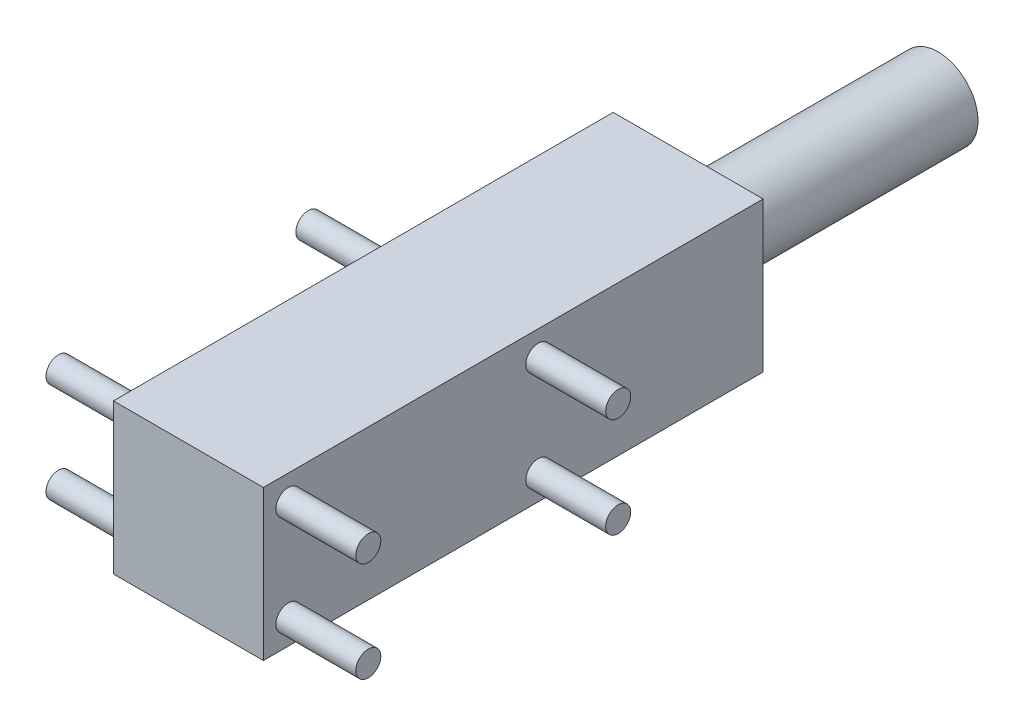
ISO-10303-21;
HEADER;
FILE_DESCRIPTION(('STEP AP214'),'2;1');
FILE_NAME('part.step','',(''),(''),'','','');
FILE_SCHEMA(('AUTOMOTIVE_DESIGN { 1 0 10303 214 1 1 1 1 }'));
ENDSEC;
DATA;
#1=APPLICATION_CONTEXT('core data for automotive mechanical design processes');
#2=APPLICATION_PROTOCOL_DEFINITION('international standard','automotive_design',2000,#1);
#3=PRODUCT_CONTEXT('',#1,'mechanical');
#4=PRODUCT('Part','Part','',(#3));
#5=PRODUCT_RELATED_PRODUCT_CATEGORY('part','',(#4));
#6=PRODUCT_DEFINITION_FORMATION('','',#4);
#7=PRODUCT_DEFINITION_CONTEXT('part definition',#1,'design');
#8=PRODUCT_DEFINITION('design','',#6,#7);
#9=PRODUCT_DEFINITION_SHAPE('','',#8);
#10=(LENGTH_UNIT() NAMED_UNIT(*) SI_UNIT(.MILLI.,.METRE.));
#11=(NAMED_UNIT(*) PLANE_ANGLE_UNIT() SI_UNIT($,.RADIAN.));
#12=(NAMED_UNIT(*) SI_UNIT($,.STERADIAN.) SOLID_ANGLE_UNIT());
#13=UNCERTAINTY_MEASURE_WITH_UNIT(LENGTH_MEASURE(1.E-05),#10,'distance_accuracy_value','');
#14=(GEOMETRIC_REPRESENTATION_CONTEXT(3) GLOBAL_UNCERTAINTY_ASSIGNED_CONTEXT((#13)) GLOBAL_UNIT_ASSIGNED_CONTEXT((#10,
#11,#12)) REPRESENTATION_CONTEXT('',''));
#15=CARTESIAN_POINT('',(0.,0.,0.));
#16=DIRECTION('',(0.,0.,1.));
#17=DIRECTION('',(1.,0.,0.));
#18=AXIS2_PLACEMENT_3D('',#15,#16,#17);
#19=CARTESIAN_POINT('',(-31.,12.5,2.49999999999999));
#20=DIRECTION('',(1.,0.,0.));
#21=DIRECTION('',(0.,0.,1.));
#22=AXIS2_PLACEMENT_3D('',#19,#20,#21);
#23=PLANE('',#22);
#24=CARTESIAN_POINT('',(-31.,10.,4.99999999999999));
#25=DIRECTION('',(1.,0.,0.));
#26=DIRECTION('',(0.,0.,-1.));
#27=AXIS2_PLACEMENT_3D('',#24,#25,#26);
#28=CIRCLE('',#27,2.5);
#29=CARTESIAN_POINT('',(-31.,10.,2.49999999999999));
#30=VERTEX_POINT('',#29);
#31=EDGE_CURVE('E82',#30,#30,#28,.T.);
#32=ORIENTED_EDGE('',*,*,#31,.F.);
#33=EDGE_LOOP('',(#32));
#34=FACE_BOUND('',#33,.T.);
#35=ADVANCED_FACE('F16',(#34),#23,.F.);
#36=CARTESIAN_POINT('',(-31.,12.5,52.5));
#37=DIRECTION('',(1.,0.,0.));
#38=DIRECTION('',(0.,0.,1.));
#39=AXIS2_PLACEMENT_3D('',#36,#37,#38);
#40=PLANE('',#39);
#41=CARTESIAN_POINT('',(-31.,10.,55.));
#42=DIRECTION('',(1.,0.,0.));
#43=DIRECTION('',(0.,0.,-1.));
#44=AXIS2_PLACEMENT_3D('',#41,#42,#43);
#45=CIRCLE('',#44,2.50000000000001);
#46=CARTESIAN_POINT('',(-31.,10.,52.5));
#47=VERTEX_POINT('',#46);
#48=EDGE_CURVE('E85',#47,#47,#45,.T.);
#49=ORIENTED_EDGE('',*,*,#48,.F.);
#50=EDGE_LOOP('',(#49));
#51=FACE_BOUND('',#50,.T.);
#52=ADVANCED_FACE('F360',(#51),#40,.F.);
#53=CARTESIAN_POINT('',(-31.,-7.49999999999999,7.49999999999999));
#54=DIRECTION('',(-1.,0.,0.));
#55=DIRECTION('',(0.,0.,-1.));
#56=AXIS2_PLACEMENT_3D('',#53,#54,#55);
#57=PLANE('',#56);
#58=CARTESIAN_POINT('',(-31.,-9.99999999999999,4.99999999999999));
#59=DIRECTION('',(1.,0.,0.));
#60=DIRECTION('',(0.,0.,-1.));
#61=AXIS2_PLACEMENT_3D('',#58,#59,#60);
#62=CIRCLE('',#61,2.5);
#63=CARTESIAN_POINT('',(-31.,-9.99999999999999,2.49999999999999));
#64=VERTEX_POINT('',#63);
#65=EDGE_CURVE('E88',#64,#64,#62,.T.);
#66=ORIENTED_EDGE('',*,*,#65,.F.);
#67=EDGE_LOOP('',(#66));
#68=FACE_BOUND('',#67,.T.);
#69=ADVANCED_FACE('F351',(#68),#57,.T.);
#70=CARTESIAN_POINT('',(-31.,-7.5,57.5));
#71=DIRECTION('',(-1.,0.,0.));
#72=DIRECTION('',(0.,0.,-1.));
#73=AXIS2_PLACEMENT_3D('',#70,#71,#72);
#74=PLANE('',#73);
#75=CARTESIAN_POINT('',(-31.,-10.,55.));
#76=DIRECTION('',(1.,0.,0.));
#77=DIRECTION('',(0.,0.,-1.));
#78=AXIS2_PLACEMENT_3D('',#75,#76,#77);
#79=CIRCLE('',#78,2.50000000000001);
#80=CARTESIAN_POINT('',(-31.,-10.,52.5));
#81=VERTEX_POINT('',#80);
#82=EDGE_CURVE('E91',#81,#81,#79,.T.);
#83=ORIENTED_EDGE('',*,*,#82,.F.);
#84=EDGE_LOOP('',(#83));
#85=FACE_BOUND('',#84,.T.);
#86=ADVANCED_FACE('F342',(#85),#74,.T.);
#87=CARTESIAN_POINT('',(8.,-8.,-90.));
#88=DIRECTION('',(0.,0.,-1.));
#89=DIRECTION('',(-1.,0.,0.));
#90=AXIS2_PLACEMENT_3D('',#87,#88,#89);
#91=PLANE('',#90);
#92=CARTESIAN_POINT('',(0.,0.,-90.));
#93=DIRECTION('',(0.,0.,1.));
#94=DIRECTION('',(1.,0.,0.));
#95=AXIS2_PLACEMENT_3D('',#92,#93,#94);
#96=CIRCLE('',#95,8.);
#97=CARTESIAN_POINT('',(8.,0.,-90.));
#98=VERTEX_POINT('',#97);
#99=EDGE_CURVE('E94',#98,#98,#96,.T.);
#100=ORIENTED_EDGE('',*,*,#99,.F.);
#101=EDGE_LOOP('',(#100));
#102=FACE_BOUND('',#101,.T.);
#103=ADVANCED_FACE('F333',(#102),#91,.T.);
#104=CARTESIAN_POINT('',(-31.,10.,4.99999999999999));
#105=DIRECTION('',(1.,0.,0.));
#106=DIRECTION('',(0.,0.,-1.));
#107=AXIS2_PLACEMENT_3D('',#104,#105,#106);
#108=CYLINDRICAL_SURFACE('',#107,2.5);
#109=CARTESIAN_POINT('',(-15.,10.,4.99999999999999));
#110=DIRECTION('',(1.,0.,0.));
#111=DIRECTION('',(0.,0.,-1.));
#112=AXIS2_PLACEMENT_3D('',#109,#110,#111);
#113=CIRCLE('',#112,2.5);
#114=CARTESIAN_POINT('',(-15.,10.,2.49999999999999));
#115=VERTEX_POINT('',#114);
#116=EDGE_CURVE('E97',#115,#115,#113,.F.);
#117=ORIENTED_EDGE('',*,*,#116,.T.);
#118=EDGE_LOOP('',(#117));
#119=FACE_BOUND('',#118,.T.);
#120=ORIENTED_EDGE('',*,*,#31,.T.);
#121=EDGE_LOOP('',(#120));
#122=FACE_BOUND('',#121,.T.);
#123=ADVANCED_FACE('F324',(#119,#122),#108,.T.);
#124=CARTESIAN_POINT('',(-31.,10.,55.));
#125=DIRECTION('',(1.,0.,0.));
#126=DIRECTION('',(0.,0.,-1.));
#127=AXIS2_PLACEMENT_3D('',#124,#125,#126);
#128=CYLINDRICAL_SURFACE('',#127,2.50000000000001);
#129=CARTESIAN_POINT('',(-15.,10.,55.));
#130=DIRECTION('',(1.,0.,0.));
#131=DIRECTION('',(0.,0.,-1.));
#132=AXIS2_PLACEMENT_3D('',#129,#130,#131);
#133=CIRCLE('',#132,2.50000000000001);
#134=CARTESIAN_POINT('',(-15.,10.,52.5));
#135=VERTEX_POINT('',#134);
#136=EDGE_CURVE('E103',#135,#135,#133,.F.);
#137=ORIENTED_EDGE('',*,*,#136,.T.);
#138=EDGE_LOOP('',(#137));
#139=FACE_BOUND('',#138,.T.);
#140=ORIENTED_EDGE('',*,*,#48,.T.);
#141=EDGE_LOOP('',(#140));
#142=FACE_BOUND('',#141,.T.);
#143=ADVANCED_FACE('F315',(#139,#142),#128,.T.);
#144=CARTESIAN_POINT('',(-31.,-9.99999999999999,4.99999999999999));
#145=DIRECTION('',(1.,0.,0.));
#146=DIRECTION('',(0.,0.,-1.));
#147=AXIS2_PLACEMENT_3D('',#144,#145,#146);
#148=CYLINDRICAL_SURFACE('',#147,2.5);
#149=CARTESIAN_POINT('',(-15.,-9.99999999999999,4.99999999999999));
#150=DIRECTION('',(1.,0.,0.));
#151=DIRECTION('',(0.,0.,-1.));
#152=AXIS2_PLACEMENT_3D('',#149,#150,#151);
#153=CIRCLE('',#152,2.5);
#154=CARTESIAN_POINT('',(-15.,-9.99999999999999,2.49999999999999));
#155=VERTEX_POINT('',#154);
#156=EDGE_CURVE('E100',#155,#155,#153,.F.);
#157=ORIENTED_EDGE('',*,*,#156,.T.);
#158=EDGE_LOOP('',(#157));
#159=FACE_BOUND('',#158,.T.);
#160=ORIENTED_EDGE('',*,*,#65,.T.);
#161=EDGE_LOOP('',(#160));
#162=FACE_BOUND('',#161,.T.);
#163=ADVANCED_FACE('F306',(#159,#162),#148,.T.);
#164=CARTESIAN_POINT('',(-31.,-10.,55.));
#165=DIRECTION('',(1.,0.,0.));
#166=DIRECTION('',(0.,0.,-1.));
#167=AXIS2_PLACEMENT_3D('',#164,#165,#166);
#168=CYLINDRICAL_SURFACE('',#167,2.50000000000001);
#169=CARTESIAN_POINT('',(-15.,-10.,55.));
#170=DIRECTION('',(1.,0.,0.));
#171=DIRECTION('',(0.,0.,-1.));
#172=AXIS2_PLACEMENT_3D('',#169,#170,#171);
#173=CIRCLE('',#172,2.50000000000001);
#174=CARTESIAN_POINT('',(-15.,-10.,52.5));
#175=VERTEX_POINT('',#174);
#176=EDGE_CURVE('E67',#175,#175,#173,.F.);
#177=ORIENTED_EDGE('',*,*,#176,.T.);
#178=EDGE_LOOP('',(#177));
#179=FACE_BOUND('',#178,.T.);
#180=ORIENTED_EDGE('',*,*,#82,.T.);
#181=EDGE_LOOP('',(#180));
#182=FACE_BOUND('',#181,.T.);
#183=ADVANCED_FACE('F297',(#179,#182),#168,.T.);
#184=CARTESIAN_POINT('',(0.,0.,-90.));
#185=DIRECTION('',(0.,0.,1.));
#186=DIRECTION('',(1.,0.,0.));
#187=AXIS2_PLACEMENT_3D('',#184,#185,#186);
#188=CYLINDRICAL_SURFACE('',#187,8.);
#189=CARTESIAN_POINT('',(0.,0.,-40.));
#190=DIRECTION('',(0.,0.,1.));
#191=DIRECTION('',(1.,0.,0.));
#192=AXIS2_PLACEMENT_3D('',#189,#190,#191);
#193=CIRCLE('',#192,8.);
#194=CARTESIAN_POINT('',(7.99999999999991,0.,-40.));
#195=VERTEX_POINT('',#194);
#196=EDGE_CURVE('E120',#195,#195,#193,.T.);
#197=ORIENTED_EDGE('',*,*,#196,.F.);
#198=EDGE_LOOP('',(#197));
#199=FACE_BOUND('',#198,.T.);
#200=ORIENTED_EDGE('',*,*,#99,.T.);
#201=EDGE_LOOP('',(#200));
#202=FACE_BOUND('',#201,.T.);
#203=ADVANCED_FACE('F288',(#199,#202),#188,.T.);
#204=CARTESIAN_POINT('',(-15.,-15.,60.));
#205=DIRECTION('',(1.,0.,0.));
#206=DIRECTION('',(0.,0.,-1.));
#207=AXIS2_PLACEMENT_3D('',#204,#205,#206);
#208=PLANE('',#207);
#209=ORIENTED_EDGE('',*,*,#176,.F.);
#210=EDGE_LOOP('',(#209));
#211=FACE_BOUND('',#210,.T.);
#212=ORIENTED_EDGE('',*,*,#156,.F.);
#213=EDGE_LOOP('',(#212));
#214=FACE_BOUND('',#213,.T.);
#215=ORIENTED_EDGE('',*,*,#136,.F.);
#216=EDGE_LOOP('',(#215));
#217=FACE_BOUND('',#216,.T.);
#218=ORIENTED_EDGE('',*,*,#116,.F.);
#219=EDGE_LOOP('',(#218));
#220=FACE_BOUND('',#219,.T.);
#221=DIRECTION('',(0.,1.,0.));
#222=VECTOR('',#221,1.);
#223=CARTESIAN_POINT('',(-15.,0.,-40.));
#224=LINE('',#223,#222);
#225=CARTESIAN_POINT('',(-15.,-15.,-40.));
#226=VERTEX_POINT('',#225);
#227=CARTESIAN_POINT('',(-15.,15.,-40.));
#228=VERTEX_POINT('',#227);
#229=EDGE_CURVE('E123',#226,#228,#224,.T.);
#230=ORIENTED_EDGE('',*,*,#229,.F.);
#231=DIRECTION('',(0.,0.,1.));
#232=VECTOR('',#231,1.);
#233=CARTESIAN_POINT('',(-15.,-15.,10.));
#234=LINE('',#233,#232);
#235=CARTESIAN_POINT('',(-15.,-15.,60.));
#236=VERTEX_POINT('',#235);
#237=EDGE_CURVE('E61',#226,#236,#234,.T.);
#238=ORIENTED_EDGE('',*,*,#237,.T.);
#239=DIRECTION('',(0.,1.,0.));
#240=VECTOR('',#239,1.);
#241=CARTESIAN_POINT('',(-15.,0.,60.));
#242=LINE('',#241,#240);
#243=CARTESIAN_POINT('',(-15.,15.,60.));
#244=VERTEX_POINT('',#243);
#245=EDGE_CURVE('E59',#236,#244,#242,.T.);
#246=ORIENTED_EDGE('',*,*,#245,.T.);
#247=DIRECTION('',(0.,0.,-1.));
#248=VECTOR('',#247,1.);
#249=CARTESIAN_POINT('',(-15.,15.,10.));
#250=LINE('',#249,#248);
#251=EDGE_CURVE('E56',#244,#228,#250,.T.);
#252=ORIENTED_EDGE('',*,*,#251,.T.);
#253=EDGE_LOOP('',(#230,#238,#246,#252));
#254=FACE_BOUND('',#253,.T.);
#255=ADVANCED_FACE('F60',(#211,#214,#217,#220,#254),#208,.F.);
#256=CARTESIAN_POINT('',(31.,7.5,2.49999999999999));
#257=DIRECTION('',(-1.,0.,0.));
#258=DIRECTION('',(0.,0.,1.));
#259=AXIS2_PLACEMENT_3D('',#256,#257,#258);
#260=PLANE('',#259);
#261=CARTESIAN_POINT('',(31.,10.,4.99999999999999));
#262=DIRECTION('',(-1.,0.,0.));
#263=DIRECTION('',(0.,0.,1.));
#264=AXIS2_PLACEMENT_3D('',#261,#262,#263);
#265=CIRCLE('',#264,2.5);
#266=CARTESIAN_POINT('',(31.,10.,7.49999999999999));
#267=VERTEX_POINT('',#266);
#268=EDGE_CURVE('E108',#267,#267,#265,.T.);
#269=ORIENTED_EDGE('',*,*,#268,.F.);
#270=EDGE_LOOP('',(#269));
#271=FACE_BOUND('',#270,.T.);
#272=ADVANCED_FACE('F192',(#271),#260,.F.);
#273=CARTESIAN_POINT('',(31.,7.5,52.5));
#274=DIRECTION('',(-1.,0.,0.));
#275=DIRECTION('',(0.,0.,1.));
#276=AXIS2_PLACEMENT_3D('',#273,#274,#275);
#277=PLANE('',#276);
#278=CARTESIAN_POINT('',(31.,10.,55.));
#279=DIRECTION('',(-1.,0.,0.));
#280=DIRECTION('',(0.,0.,1.));
#281=AXIS2_PLACEMENT_3D('',#278,#279,#280);
#282=CIRCLE('',#281,2.50000000000001);
#283=CARTESIAN_POINT('',(31.,10.,57.5));
#284=VERTEX_POINT('',#283);
#285=EDGE_CURVE('E111',#284,#284,#282,.T.);
#286=ORIENTED_EDGE('',*,*,#285,.F.);
#287=EDGE_LOOP('',(#286));
#288=FACE_BOUND('',#287,.T.);
#289=ADVANCED_FACE('F184',(#288),#277,.F.);
#290=CARTESIAN_POINT('',(31.,-12.5,7.49999999999999));
#291=DIRECTION('',(1.,0.,0.));
#292=DIRECTION('',(0.,0.,-1.));
#293=AXIS2_PLACEMENT_3D('',#290,#291,#292);
#294=PLANE('',#293);
#295=CARTESIAN_POINT('',(31.,-10.,4.99999999999999));
#296=DIRECTION('',(-1.,0.,0.));
#297=DIRECTION('',(0.,0.,1.));
#298=AXIS2_PLACEMENT_3D('',#295,#296,#297);
#299=CIRCLE('',#298,2.5);
#300=CARTESIAN_POINT('',(31.,-9.99999999999999,7.49999999999999));
#301=VERTEX_POINT('',#300);
#302=EDGE_CURVE('E114',#301,#301,#299,.T.);
#303=ORIENTED_EDGE('',*,*,#302,.F.);
#304=EDGE_LOOP('',(#303));
#305=FACE_BOUND('',#304,.T.);
#306=ADVANCED_FACE('F181',(#305),#294,.T.);
#307=CARTESIAN_POINT('',(31.,-12.5,57.5));
#308=DIRECTION('',(1.,0.,0.));
#309=DIRECTION('',(0.,0.,-1.));
#310=AXIS2_PLACEMENT_3D('',#307,#308,#309);
#311=PLANE('',#310);
#312=CARTESIAN_POINT('',(31.,-10.,55.));
#313=DIRECTION('',(-1.,0.,0.));
#314=DIRECTION('',(0.,0.,1.));
#315=AXIS2_PLACEMENT_3D('',#312,#313,#314);
#316=CIRCLE('',#315,2.5);
#317=CARTESIAN_POINT('',(31.,-9.99999999999999,57.5));
#318=VERTEX_POINT('',#317);
#319=EDGE_CURVE('E117',#318,#318,#316,.T.);
#320=ORIENTED_EDGE('',*,*,#319,.F.);
#321=EDGE_LOOP('',(#320));
#322=FACE_BOUND('',#321,.T.);
#323=ADVANCED_FACE('F183',(#322),#311,.T.);
#324=CARTESIAN_POINT('',(15.,-15.,60.));
#325=DIRECTION('',(0.,0.,-1.));
#326=DIRECTION('',(-1.,0.,0.));
#327=AXIS2_PLACEMENT_3D('',#324,#325,#326);
#328=PLANE('',#327);
#329=DIRECTION('',(-1.,0.,0.));
#330=VECTOR('',#329,1.);
#331=CARTESIAN_POINT('',(0.,15.,60.));
#332=LINE('',#331,#330);
#333=CARTESIAN_POINT('',(15.,15.,60.));
#334=VERTEX_POINT('',#333);
#335=EDGE_CURVE('E66',#334,#244,#332,.T.);
#336=ORIENTED_EDGE('',*,*,#335,.T.);
#337=ORIENTED_EDGE('',*,*,#245,.F.);
#338=DIRECTION('',(1.,0.,0.));
#339=VECTOR('',#338,1.);
#340=CARTESIAN_POINT('',(0.,-15.,60.));
#341=LINE('',#340,#339);
#342=CARTESIAN_POINT('',(15.,-15.,60.));
#343=VERTEX_POINT('',#342);
#344=EDGE_CURVE('E122',#236,#343,#341,.T.);
#345=ORIENTED_EDGE('',*,*,#344,.T.);
#346=DIRECTION('',(0.,1.,0.));
#347=VECTOR('',#346,1.);
#348=CARTESIAN_POINT('',(15.,0.,60.));
#349=LINE('',#348,#347);
#350=EDGE_CURVE('E78',#343,#334,#349,.T.);
#351=ORIENTED_EDGE('',*,*,#350,.T.);
#352=EDGE_LOOP('',(#336,#337,#345,#351));
#353=FACE_BOUND('',#352,.T.);
#354=ADVANCED_FACE('F77',(#353),#328,.F.);
#355=CARTESIAN_POINT('',(-15.,15.,60.));
#356=DIRECTION('',(0.,-1.,0.));
#357=DIRECTION('',(0.,0.,-1.));
#358=AXIS2_PLACEMENT_3D('',#355,#356,#357);
#359=PLANE('',#358);
#360=DIRECTION('',(1.,0.,0.));
#361=VECTOR('',#360,1.);
#362=CARTESIAN_POINT('',(0.,15.,-40.));
#363=LINE('',#362,#361);
#364=CARTESIAN_POINT('',(15.,15.,-40.));
#365=VERTEX_POINT('',#364);
#366=EDGE_CURVE('E74',#228,#365,#363,.T.);
#367=ORIENTED_EDGE('',*,*,#366,.F.);
#368=ORIENTED_EDGE('',*,*,#251,.F.);
#369=ORIENTED_EDGE('',*,*,#335,.F.);
#370=DIRECTION('',(0.,0.,-1.));
#371=VECTOR('',#370,1.);
#372=CARTESIAN_POINT('',(15.,15.,10.));
#373=LINE('',#372,#371);
#374=EDGE_CURVE('E137',#334,#365,#373,.T.);
#375=ORIENTED_EDGE('',*,*,#374,.T.);
#376=EDGE_LOOP('',(#367,#368,#369,#375));
#377=FACE_BOUND('',#376,.T.);
#378=ADVANCED_FACE('F71',(#377),#359,.F.);
#379=CARTESIAN_POINT('',(15.,-15.,-40.));
#380=DIRECTION('',(0.,0.,-1.));
#381=DIRECTION('',(-1.,0.,0.));
#382=AXIS2_PLACEMENT_3D('',#379,#380,#381);
#383=PLANE('',#382);
#384=ORIENTED_EDGE('',*,*,#196,.T.);
#385=EDGE_LOOP('',(#384));
#386=FACE_BOUND('',#385,.T.);
#387=DIRECTION('',(-1.,0.,0.));
#388=VECTOR('',#387,1.);
#389=CARTESIAN_POINT('',(0.,-15.,-40.));
#390=LINE('',#389,#388);
#391=CARTESIAN_POINT('',(15.,-15.,-40.));
#392=VERTEX_POINT('',#391);
#393=EDGE_CURVE('E35',#392,#226,#390,.T.);
#394=ORIENTED_EDGE('',*,*,#393,.T.);
#395=ORIENTED_EDGE('',*,*,#229,.T.);
#396=ORIENTED_EDGE('',*,*,#366,.T.);
#397=DIRECTION('',(0.,-1.,0.));
#398=VECTOR('',#397,1.);
#399=CARTESIAN_POINT('',(15.,0.,-40.));
#400=LINE('',#399,#398);
#401=EDGE_CURVE('E134',#365,#392,#400,.T.);
#402=ORIENTED_EDGE('',*,*,#401,.T.);
#403=EDGE_LOOP('',(#394,#395,#396,#402));
#404=FACE_BOUND('',#403,.T.);
#405=ADVANCED_FACE('F147',(#386,#404),#383,.T.);
#406=CARTESIAN_POINT('',(-15.,-15.,-40.));
#407=DIRECTION('',(0.,1.,0.));
#408=DIRECTION('',(0.,0.,1.));
#409=AXIS2_PLACEMENT_3D('',#406,#407,#408);
#410=PLANE('',#409);
#411=ORIENTED_EDGE('',*,*,#393,.F.);
#412=DIRECTION('',(0.,0.,1.));
#413=VECTOR('',#412,1.);
#414=CARTESIAN_POINT('',(15.,-15.,10.));
#415=LINE('',#414,#413);
#416=EDGE_CURVE('E131',#392,#343,#415,.T.);
#417=ORIENTED_EDGE('',*,*,#416,.T.);
#418=ORIENTED_EDGE('',*,*,#344,.F.);
#419=ORIENTED_EDGE('',*,*,#237,.F.);
#420=EDGE_LOOP('',(#411,#417,#418,#419));
#421=FACE_BOUND('',#420,.T.);
#422=ADVANCED_FACE('F149',(#421),#410,.F.);
#423=CARTESIAN_POINT('',(31.,10.,4.99999999999999));
#424=DIRECTION('',(-1.,0.,0.));
#425=DIRECTION('',(0.,0.,1.));
#426=AXIS2_PLACEMENT_3D('',#423,#424,#425);
#427=CYLINDRICAL_SURFACE('',#426,2.5);
#428=CARTESIAN_POINT('',(15.,10.,4.99999999999999));
#429=DIRECTION('',(-1.,0.,0.));
#430=DIRECTION('',(0.,0.,1.));
#431=AXIS2_PLACEMENT_3D('',#428,#429,#430);
#432=CIRCLE('',#431,2.5);
#433=CARTESIAN_POINT('',(15.,10.,7.49999999999999));
#434=VERTEX_POINT('',#433);
#435=EDGE_CURVE('E20',#434,#434,#432,.F.);
#436=ORIENTED_EDGE('',*,*,#435,.T.);
#437=EDGE_LOOP('',(#436));
#438=FACE_BOUND('',#437,.T.);
#439=ORIENTED_EDGE('',*,*,#268,.T.);
#440=EDGE_LOOP('',(#439));
#441=FACE_BOUND('',#440,.T.);
#442=ADVANCED_FACE('F151',(#438,#441),#427,.T.);
#443=CARTESIAN_POINT('',(31.,10.,55.));
#444=DIRECTION('',(-1.,0.,0.));
#445=DIRECTION('',(0.,0.,1.));
#446=AXIS2_PLACEMENT_3D('',#443,#444,#445);
#447=CYLINDRICAL_SURFACE('',#446,2.50000000000001);
#448=CARTESIAN_POINT('',(15.,10.,55.));
#449=DIRECTION('',(-1.,0.,0.));
#450=DIRECTION('',(0.,0.,1.));
#451=AXIS2_PLACEMENT_3D('',#448,#449,#450);
#452=CIRCLE('',#451,2.5);
#453=CARTESIAN_POINT('',(15.,10.,57.5));
#454=VERTEX_POINT('',#453);
#455=EDGE_CURVE('E126',#454,#454,#452,.F.);
#456=ORIENTED_EDGE('',*,*,#455,.T.);
#457=EDGE_LOOP('',(#456));
#458=FACE_BOUND('',#457,.T.);
#459=ORIENTED_EDGE('',*,*,#285,.T.);
#460=EDGE_LOOP('',(#459));
#461=FACE_BOUND('',#460,.T.);
#462=ADVANCED_FACE('F158',(#458,#461),#447,.T.);
#463=CARTESIAN_POINT('',(31.,-10.,4.99999999999999));
#464=DIRECTION('',(-1.,0.,0.));
#465=DIRECTION('',(0.,0.,1.));
#466=AXIS2_PLACEMENT_3D('',#463,#464,#465);
#467=CYLINDRICAL_SURFACE('',#466,2.5);
#468=CARTESIAN_POINT('',(15.,-9.99999999999999,5.));
#469=DIRECTION('',(-1.,0.,0.));
#470=DIRECTION('',(0.,0.,1.));
#471=AXIS2_PLACEMENT_3D('',#468,#469,#470);
#472=CIRCLE('',#471,2.5);
#473=CARTESIAN_POINT('',(15.,-9.99999999999999,7.5));
#474=VERTEX_POINT('',#473);
#475=EDGE_CURVE('E26',#474,#474,#472,.F.);
#476=ORIENTED_EDGE('',*,*,#475,.T.);
#477=EDGE_LOOP('',(#476));
#478=FACE_BOUND('',#477,.T.);
#479=ORIENTED_EDGE('',*,*,#302,.T.);
#480=EDGE_LOOP('',(#479));
#481=FACE_BOUND('',#480,.T.);
#482=ADVANCED_FACE('F168',(#478,#481),#467,.T.);
#483=CARTESIAN_POINT('',(31.,-10.,55.));
#484=DIRECTION('',(-1.,0.,0.));
#485=DIRECTION('',(0.,0.,1.));
#486=AXIS2_PLACEMENT_3D('',#483,#484,#485);
#487=CYLINDRICAL_SURFACE('',#486,2.5);
#488=CARTESIAN_POINT('',(15.,-10.,55.));
#489=DIRECTION('',(-1.,0.,0.));
#490=DIRECTION('',(0.,0.,1.));
#491=AXIS2_PLACEMENT_3D('',#488,#489,#490);
#492=CIRCLE('',#491,2.50000000000001);
#493=CARTESIAN_POINT('',(15.,-10.,57.5));
#494=VERTEX_POINT('',#493);
#495=EDGE_CURVE('E11',#494,#494,#492,.F.);
#496=ORIENTED_EDGE('',*,*,#495,.T.);
#497=EDGE_LOOP('',(#496));
#498=FACE_BOUND('',#497,.T.);
#499=ORIENTED_EDGE('',*,*,#319,.T.);
#500=EDGE_LOOP('',(#499));
#501=FACE_BOUND('',#500,.T.);
#502=ADVANCED_FACE('F163',(#498,#501),#487,.T.);
#503=CARTESIAN_POINT('',(15.,-15.,-40.));
#504=DIRECTION('',(-1.,0.,0.));
#505=DIRECTION('',(0.,0.,1.));
#506=AXIS2_PLACEMENT_3D('',#503,#504,#505);
#507=PLANE('',#506);
#508=ORIENTED_EDGE('',*,*,#495,.F.);
#509=EDGE_LOOP('',(#508));
#510=FACE_BOUND('',#509,.T.);
#511=ORIENTED_EDGE('',*,*,#475,.F.);
#512=EDGE_LOOP('',(#511));
#513=FACE_BOUND('',#512,.T.);
#514=ORIENTED_EDGE('',*,*,#455,.F.);
#515=EDGE_LOOP('',(#514));
#516=FACE_BOUND('',#515,.T.);
#517=ORIENTED_EDGE('',*,*,#435,.F.);
#518=EDGE_LOOP('',(#517));
#519=FACE_BOUND('',#518,.T.);
#520=ORIENTED_EDGE('',*,*,#401,.F.);
#521=ORIENTED_EDGE('',*,*,#374,.F.);
#522=ORIENTED_EDGE('',*,*,#350,.F.);
#523=ORIENTED_EDGE('',*,*,#416,.F.);
#524=EDGE_LOOP('',(#520,#521,#522,#523));
#525=FACE_BOUND('',#524,.T.);
#526=ADVANCED_FACE('F18',(#510,#513,#516,#519,#525),#507,.F.);
#527=CLOSED_SHELL('',(#35,#52,#69,#86,#103,#123,#143,#163,#183,#203,#255,#272,#289,#306,#323,
#354,#378,#405,#422,#442,#462,#482,#502,#526));
#528=MANIFOLD_SOLID_BREP('B1',#527);
#529=ADVANCED_BREP_SHAPE_REPRESENTATION('',(#18,#528),#14);
#530=SHAPE_DEFINITION_REPRESENTATION(#9,#529);
ENDSEC;
END-ISO-10303-21;
